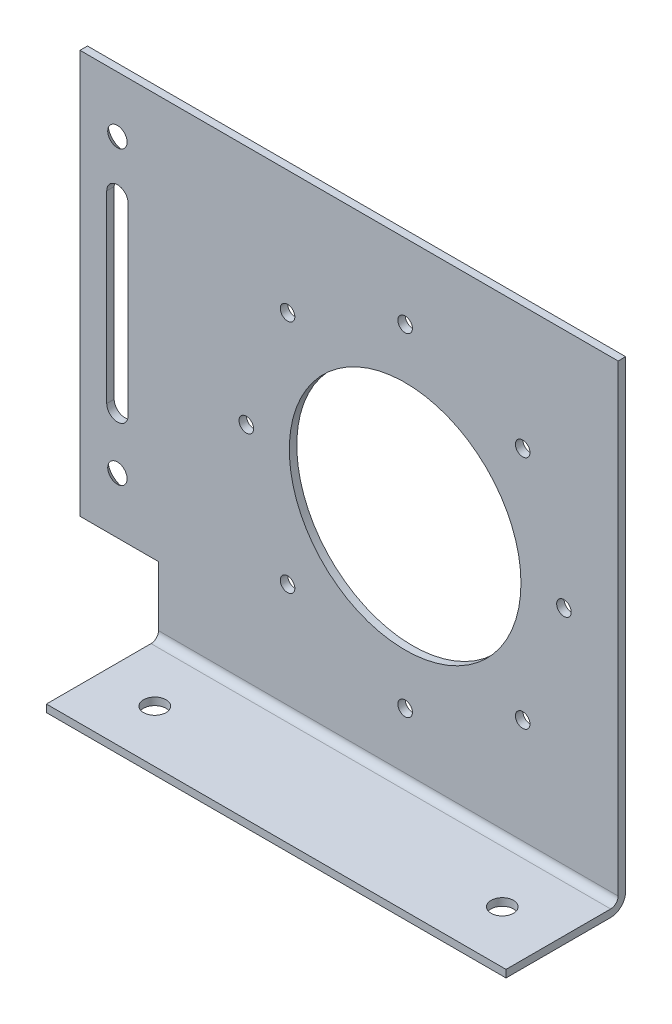
ISO-10303-21;
HEADER;
FILE_DESCRIPTION(('STEP AP214'),'2;1');
FILE_NAME('part.step','',(''),(''),'','','');
FILE_SCHEMA(('AUTOMOTIVE_DESIGN { 1 0 10303 214 1 1 1 1 }'));
ENDSEC;
DATA;
#1=APPLICATION_CONTEXT('core data for automotive mechanical design processes');
#2=APPLICATION_PROTOCOL_DEFINITION('international standard','automotive_design',2000,#1);
#3=PRODUCT_CONTEXT('',#1,'mechanical');
#4=PRODUCT('Part','Part','',(#3));
#5=PRODUCT_RELATED_PRODUCT_CATEGORY('part','',(#4));
#6=PRODUCT_DEFINITION_FORMATION('','',#4);
#7=PRODUCT_DEFINITION_CONTEXT('part definition',#1,'design');
#8=PRODUCT_DEFINITION('design','',#6,#7);
#9=PRODUCT_DEFINITION_SHAPE('','',#8);
#10=(LENGTH_UNIT() NAMED_UNIT(*) SI_UNIT(.MILLI.,.METRE.));
#11=(NAMED_UNIT(*) PLANE_ANGLE_UNIT() SI_UNIT($,.RADIAN.));
#12=(NAMED_UNIT(*) SI_UNIT($,.STERADIAN.) SOLID_ANGLE_UNIT());
#13=UNCERTAINTY_MEASURE_WITH_UNIT(LENGTH_MEASURE(1.E-05),#10,'distance_accuracy_value','');
#14=(GEOMETRIC_REPRESENTATION_CONTEXT(3) GLOBAL_UNCERTAINTY_ASSIGNED_CONTEXT((#13)) GLOBAL_UNIT_ASSIGNED_CONTEXT((#10,
#11,#12)) REPRESENTATION_CONTEXT('',''));
#15=CARTESIAN_POINT('',(0.,0.,0.));
#16=DIRECTION('',(0.,0.,1.));
#17=DIRECTION('',(1.,0.,0.));
#18=AXIS2_PLACEMENT_3D('',#15,#16,#17);
#19=CARTESIAN_POINT('',(0.,0.,4.));
#20=DIRECTION('',(0.,0.,-1.));
#21=DIRECTION('',(1.,0.,0.));
#22=AXIS2_PLACEMENT_3D('',#19,#20,#21);
#23=PLANE('',#22);
#24=CARTESIAN_POINT('',(17.9765527034874,41.3541753746779,4.));
#25=DIRECTION('',(0.,0.,1.));
#26=DIRECTION('',(1.,0.,0.));
#27=AXIS2_PLACEMENT_3D('',#24,#25,#26);
#28=CIRCLE('',#27,1.95);
#29=CARTESIAN_POINT('',(19.9265527034874,41.3541753746779,4.));
#30=VERTEX_POINT('',#29);
#31=EDGE_CURVE('E204',#30,#30,#28,.T.);
#32=ORIENTED_EDGE('',*,*,#31,.F.);
#33=EDGE_LOOP('',(#32));
#34=FACE_BOUND('',#33,.T.);
#35=CARTESIAN_POINT('',(-13.489699059314,28.3204271374793,4.));
#36=DIRECTION('',(0.,0.,1.));
#37=DIRECTION('',(1.,0.,0.));
#38=AXIS2_PLACEMENT_3D('',#35,#36,#37);
#39=CIRCLE('',#38,1.95);
#40=CARTESIAN_POINT('',(-11.539699059314,28.3204271374793,4.));
#41=VERTEX_POINT('',#40);
#42=EDGE_CURVE('E201',#41,#41,#39,.T.);
#43=ORIENTED_EDGE('',*,*,#42,.F.);
#44=EDGE_LOOP('',(#43));
#45=FACE_BOUND('',#44,.T.);
#46=CARTESIAN_POINT('',(60.4765527034874,-3.14582462532208,4.));
#47=DIRECTION('',(0.,0.,1.));
#48=DIRECTION('',(1.,0.,0.));
#49=AXIS2_PLACEMENT_3D('',#46,#47,#48);
#50=CIRCLE('',#49,1.95);
#51=CARTESIAN_POINT('',(62.4265527034874,-3.14582462532208,4.));
#52=VERTEX_POINT('',#51);
#53=EDGE_CURVE('E198',#52,#52,#50,.T.);
#54=ORIENTED_EDGE('',*,*,#53,.F.);
#55=EDGE_LOOP('',(#54));
#56=FACE_BOUND('',#55,.T.);
#57=CARTESIAN_POINT('',(-13.489699059314,-34.6120763881235,4.));
#58=DIRECTION('',(0.,0.,1.));
#59=DIRECTION('',(1.,0.,0.));
#60=AXIS2_PLACEMENT_3D('',#57,#58,#59);
#61=CIRCLE('',#60,1.95);
#62=CARTESIAN_POINT('',(-11.539699059314,-34.6120763881235,4.));
#63=VERTEX_POINT('',#62);
#64=EDGE_CURVE('E195',#63,#63,#61,.T.);
#65=ORIENTED_EDGE('',*,*,#64,.F.);
#66=EDGE_LOOP('',(#65));
#67=FACE_BOUND('',#66,.T.);
#68=CARTESIAN_POINT('',(17.9765527034874,-47.6458246253221,4.));
#69=DIRECTION('',(0.,0.,1.));
#70=DIRECTION('',(1.,0.,0.));
#71=AXIS2_PLACEMENT_3D('',#68,#69,#70);
#72=CIRCLE('',#71,1.95);
#73=CARTESIAN_POINT('',(19.9265527034874,-47.6458246253221,4.));
#74=VERTEX_POINT('',#73);
#75=EDGE_CURVE('E192',#74,#74,#72,.T.);
#76=ORIENTED_EDGE('',*,*,#75,.F.);
#77=EDGE_LOOP('',(#76));
#78=FACE_BOUND('',#77,.T.);
#79=CARTESIAN_POINT('',(49.4428044662887,28.3204271374793,4.));
#80=DIRECTION('',(0.,0.,1.));
#81=DIRECTION('',(1.,0.,0.));
#82=AXIS2_PLACEMENT_3D('',#79,#80,#81);
#83=CIRCLE('',#82,1.95);
#84=CARTESIAN_POINT('',(51.3928044662887,28.3204271374793,4.));
#85=VERTEX_POINT('',#84);
#86=EDGE_CURVE('E189',#85,#85,#83,.T.);
#87=ORIENTED_EDGE('',*,*,#86,.F.);
#88=EDGE_LOOP('',(#87));
#89=FACE_BOUND('',#88,.T.);
#90=CARTESIAN_POINT('',(17.9765527034874,-3.14582462532208,4.));
#91=DIRECTION('',(0.,0.,1.));
#92=DIRECTION('',(1.,0.,0.));
#93=AXIS2_PLACEMENT_3D('',#90,#91,#92);
#94=CIRCLE('',#93,31.);
#95=CARTESIAN_POINT('',(48.9765527034874,-3.14582462532208,4.));
#96=VERTEX_POINT('',#95);
#97=EDGE_CURVE('E186',#96,#96,#94,.T.);
#98=ORIENTED_EDGE('',*,*,#97,.F.);
#99=EDGE_LOOP('',(#98));
#100=FACE_BOUND('',#99,.T.);
#101=CARTESIAN_POINT('',(-24.5234472965126,-3.14582462532208,4.));
#102=DIRECTION('',(0.,0.,1.));
#103=DIRECTION('',(1.,0.,0.));
#104=AXIS2_PLACEMENT_3D('',#101,#102,#103);
#105=CIRCLE('',#104,1.95);
#106=CARTESIAN_POINT('',(-22.5734472965126,-3.14582462532208,4.));
#107=VERTEX_POINT('',#106);
#108=EDGE_CURVE('E183',#107,#107,#105,.T.);
#109=ORIENTED_EDGE('',*,*,#108,.F.);
#110=EDGE_LOOP('',(#109));
#111=FACE_BOUND('',#110,.T.);
#112=CARTESIAN_POINT('',(49.4428044662887,-34.6120763881234,4.));
#113=DIRECTION('',(0.,0.,1.));
#114=DIRECTION('',(1.,0.,0.));
#115=AXIS2_PLACEMENT_3D('',#112,#113,#114);
#116=CIRCLE('',#115,1.95);
#117=CARTESIAN_POINT('',(51.3928044662887,-34.6120763881234,4.));
#118=VERTEX_POINT('',#117);
#119=EDGE_CURVE('E180',#118,#118,#116,.T.);
#120=ORIENTED_EDGE('',*,*,#119,.F.);
#121=EDGE_LOOP('',(#120));
#122=FACE_BOUND('',#121,.T.);
#123=DIRECTION('',(0.,-1.,0.));
#124=VECTOR('',#123,1.);
#125=CARTESIAN_POINT('',(-61.8816570408644,0.,4.));
#126=LINE('',#125,#124);
#127=CARTESIAN_POINT('',(-61.8816570408644,32.3541753746779,4.));
#128=VERTEX_POINT('',#127);
#129=CARTESIAN_POINT('',(-61.8816570408644,-16.9351822342256,4.));
#130=VERTEX_POINT('',#129);
#131=EDGE_CURVE('E150',#128,#130,#126,.T.);
#132=ORIENTED_EDGE('',*,*,#131,.F.);
#133=CARTESIAN_POINT('',(-59.0234472965126,32.3541753746779,4.));
#134=DIRECTION('',(0.,0.,1.));
#135=DIRECTION('',(1.,0.,0.));
#136=AXIS2_PLACEMENT_3D('',#133,#134,#135);
#137=CIRCLE('',#136,2.85820974435178);
#138=CARTESIAN_POINT('',(-56.1652375521608,32.3541753746779,4.));
#139=VERTEX_POINT('',#138);
#140=EDGE_CURVE('E174',#139,#128,#137,.T.);
#141=ORIENTED_EDGE('',*,*,#140,.F.);
#142=DIRECTION('',(0.,1.,0.));
#143=VECTOR('',#142,1.);
#144=CARTESIAN_POINT('',(-56.1652375521608,0.,4.));
#145=LINE('',#144,#143);
#146=CARTESIAN_POINT('',(-56.1652375521608,-16.9351822342256,4.));
#147=VERTEX_POINT('',#146);
#148=EDGE_CURVE('E172',#147,#139,#145,.T.);
#149=ORIENTED_EDGE('',*,*,#148,.F.);
#150=CARTESIAN_POINT('',(-59.0234472965126,-16.9351822342256,4.));
#151=DIRECTION('',(0.,0.,1.));
#152=DIRECTION('',(1.,0.,0.));
#153=AXIS2_PLACEMENT_3D('',#150,#151,#152);
#154=CIRCLE('',#153,2.85820974435177);
#155=EDGE_CURVE('E178',#130,#147,#154,.T.);
#156=ORIENTED_EDGE('',*,*,#155,.F.);
#157=EDGE_LOOP('',(#132,#141,#149,#156));
#158=FACE_BOUND('',#157,.T.);
#159=CARTESIAN_POINT('',(-59.0234472965126,46.3541753746779,4.));
#160=DIRECTION('',(0.,0.,1.));
#161=DIRECTION('',(1.,0.,0.));
#162=AXIS2_PLACEMENT_3D('',#159,#160,#161);
#163=CIRCLE('',#162,2.59);
#164=CARTESIAN_POINT('',(-56.4334472965126,46.3541753746779,4.));
#165=VERTEX_POINT('',#164);
#166=EDGE_CURVE('E43',#165,#165,#163,.T.);
#167=ORIENTED_EDGE('',*,*,#166,.F.);
#168=EDGE_LOOP('',(#167));
#169=FACE_BOUND('',#168,.T.);
#170=CARTESIAN_POINT('',(-59.0234472965126,-31.6458246253221,4.));
#171=DIRECTION('',(0.,0.,1.));
#172=DIRECTION('',(1.,0.,0.));
#173=AXIS2_PLACEMENT_3D('',#170,#171,#172);
#174=CIRCLE('',#173,2.59);
#175=CARTESIAN_POINT('',(-56.4334472965126,-31.6458246253221,4.));
#176=VERTEX_POINT('',#175);
#177=EDGE_CURVE('E213',#176,#176,#174,.T.);
#178=ORIENTED_EDGE('',*,*,#177,.F.);
#179=EDGE_LOOP('',(#178));
#180=FACE_BOUND('',#179,.T.);
#181=DIRECTION('',(0.,1.,0.));
#182=VECTOR('',#181,1.);
#183=CARTESIAN_POINT('',(74.9765527034874,-66.6458246253221,4.));
#184=LINE('',#183,#182);
#185=CARTESIAN_POINT('',(74.9765527034874,-62.6458246253221,4.));
#186=VERTEX_POINT('',#185);
#187=CARTESIAN_POINT('',(74.9765527034874,61.3541753746779,4.));
#188=VERTEX_POINT('',#187);
#189=EDGE_CURVE('E264',#186,#188,#184,.T.);
#190=ORIENTED_EDGE('',*,*,#189,.T.);
#191=DIRECTION('',(-1.,0.,0.));
#192=VECTOR('',#191,1.);
#193=CARTESIAN_POINT('',(74.9765527034874,61.3541753746779,4.));
#194=LINE('',#193,#192);
#195=CARTESIAN_POINT('',(-69.0234472965126,61.3541753746779,4.));
#196=VERTEX_POINT('',#195);
#197=EDGE_CURVE('E244',#188,#196,#194,.T.);
#198=ORIENTED_EDGE('',*,*,#197,.T.);
#199=DIRECTION('',(0.,-1.,0.));
#200=VECTOR('',#199,1.);
#201=CARTESIAN_POINT('',(-69.0234472965126,-46.6458246253221,4.));
#202=LINE('',#201,#200);
#203=CARTESIAN_POINT('',(-69.0234472965126,-46.6458246253221,4.));
#204=VERTEX_POINT('',#203);
#205=EDGE_CURVE('E239',#196,#204,#202,.T.);
#206=ORIENTED_EDGE('',*,*,#205,.T.);
#207=DIRECTION('',(1.,0.,0.));
#208=VECTOR('',#207,1.);
#209=CARTESIAN_POINT('',(-69.0234472965126,-46.6458246253221,4.));
#210=LINE('',#209,#208);
#211=CARTESIAN_POINT('',(-48.0234472965126,-46.6458246253221,4.));
#212=VERTEX_POINT('',#211);
#213=EDGE_CURVE('E258',#204,#212,#210,.T.);
#214=ORIENTED_EDGE('',*,*,#213,.T.);
#215=DIRECTION('',(0.,-1.,0.));
#216=VECTOR('',#215,1.);
#217=CARTESIAN_POINT('',(-48.0234472965126,-46.6458246253221,4.));
#218=LINE('',#217,#216);
#219=CARTESIAN_POINT('',(-48.0234472965126,-62.6458246253221,4.));
#220=VERTEX_POINT('',#219);
#221=EDGE_CURVE('E261',#212,#220,#218,.T.);
#222=ORIENTED_EDGE('',*,*,#221,.T.);
#223=DIRECTION('',(1.,0.,0.));
#224=VECTOR('',#223,1.);
#225=CARTESIAN_POINT('',(-48.0234472965126,-62.6458246253221,4.));
#226=LINE('',#225,#224);
#227=EDGE_CURVE('E284',#186,#220,#226,.F.);
#228=ORIENTED_EDGE('',*,*,#227,.F.);
#229=EDGE_LOOP('',(#190,#198,#206,#214,#222,#228));
#230=FACE_BOUND('',#229,.T.);
#231=ADVANCED_FACE('F39',(#34,#45,#56,#67,#78,#89,#100,#111,#122,#158,#169,#180,#230),#23,.F.);
#232=CARTESIAN_POINT('',(-69.0234472965126,-46.6458246253221,2.));
#233=DIRECTION('',(1.,0.,0.));
#234=DIRECTION('',(0.,0.,1.));
#235=AXIS2_PLACEMENT_3D('',#232,#233,#234);
#236=PLANE('',#235);
#237=ORIENTED_EDGE('',*,*,#205,.F.);
#238=DIRECTION('',(0.,0.,1.));
#239=VECTOR('',#238,1.);
#240=CARTESIAN_POINT('',(-69.0234472965126,61.3541753746779,2.));
#241=LINE('',#240,#239);
#242=CARTESIAN_POINT('',(-69.0234472965126,61.3541753746779,2.));
#243=VERTEX_POINT('',#242);
#244=EDGE_CURVE('E255',#243,#196,#241,.T.);
#245=ORIENTED_EDGE('',*,*,#244,.F.);
#246=DIRECTION('',(0.,-1.,0.));
#247=VECTOR('',#246,1.);
#248=CARTESIAN_POINT('',(-69.0234472965126,-46.6458246253221,2.));
#249=LINE('',#248,#247);
#250=CARTESIAN_POINT('',(-69.0234472965126,-46.6458246253221,2.));
#251=VERTEX_POINT('',#250);
#252=EDGE_CURVE('E240',#243,#251,#249,.T.);
#253=ORIENTED_EDGE('',*,*,#252,.T.);
#254=DIRECTION('',(0.,0.,1.));
#255=VECTOR('',#254,1.);
#256=CARTESIAN_POINT('',(-69.0234472965126,-46.6458246253221,2.));
#257=LINE('',#256,#255);
#258=EDGE_CURVE('E280',#251,#204,#257,.T.);
#259=ORIENTED_EDGE('',*,*,#258,.T.);
#260=EDGE_LOOP('',(#237,#245,#253,#259));
#261=FACE_BOUND('',#260,.T.);
#262=ADVANCED_FACE('F350',(#261),#236,.F.);
#263=CARTESIAN_POINT('',(-69.0234472965126,-46.6458246253221,2.));
#264=DIRECTION('',(0.,1.,0.));
#265=DIRECTION('',(0.,0.,-1.));
#266=AXIS2_PLACEMENT_3D('',#263,#264,#265);
#267=PLANE('',#266);
#268=ORIENTED_EDGE('',*,*,#213,.F.);
#269=ORIENTED_EDGE('',*,*,#258,.F.);
#270=DIRECTION('',(1.,0.,0.));
#271=VECTOR('',#270,1.);
#272=CARTESIAN_POINT('',(-69.0234472965126,-46.6458246253221,2.));
#273=LINE('',#272,#271);
#274=CARTESIAN_POINT('',(-48.0234472965126,-46.6458246253221,2.));
#275=VERTEX_POINT('',#274);
#276=EDGE_CURVE('E243',#251,#275,#273,.T.);
#277=ORIENTED_EDGE('',*,*,#276,.T.);
#278=DIRECTION('',(0.,0.,1.));
#279=VECTOR('',#278,1.);
#280=CARTESIAN_POINT('',(-48.0234472965126,-46.6458246253221,2.));
#281=LINE('',#280,#279);
#282=EDGE_CURVE('E278',#275,#212,#281,.T.);
#283=ORIENTED_EDGE('',*,*,#282,.T.);
#284=EDGE_LOOP('',(#268,#269,#277,#283));
#285=FACE_BOUND('',#284,.T.);
#286=ADVANCED_FACE('F334',(#285),#267,.F.);
#287=CARTESIAN_POINT('',(-48.0234472965126,-46.6458246253221,2.));
#288=DIRECTION('',(1.,0.,0.));
#289=DIRECTION('',(0.,1.,0.));
#290=AXIS2_PLACEMENT_3D('',#287,#288,#289);
#291=PLANE('',#290);
#292=DIRECTION('',(0.,0.,1.));
#293=VECTOR('',#292,1.);
#294=CARTESIAN_POINT('',(-48.0234472965126,-66.6458246253221,2.));
#295=LINE('',#294,#293);
#296=CARTESIAN_POINT('',(-48.0234472965126,-66.6458246253221,6.));
#297=VERTEX_POINT('',#296);
#298=CARTESIAN_POINT('',(-48.0234472965126,-66.6458246253221,34.));
#299=VERTEX_POINT('',#298);
#300=EDGE_CURVE('E275',#297,#299,#295,.T.);
#301=ORIENTED_EDGE('',*,*,#300,.T.);
#302=DIRECTION('',(0.,1.,0.));
#303=VECTOR('',#302,1.);
#304=CARTESIAN_POINT('',(-48.0234472965126,-64.6458246253221,34.));
#305=LINE('',#304,#303);
#306=CARTESIAN_POINT('',(-48.0234472965126,-64.6458246253221,34.));
#307=VERTEX_POINT('',#306);
#308=EDGE_CURVE('E228',#299,#307,#305,.T.);
#309=ORIENTED_EDGE('',*,*,#308,.T.);
#310=DIRECTION('',(0.,0.,-1.));
#311=VECTOR('',#310,1.);
#312=CARTESIAN_POINT('',(-48.0234472965126,-64.6458246253221,34.));
#313=LINE('',#312,#311);
#314=CARTESIAN_POINT('',(-48.0234472965126,-64.6458246253221,6.));
#315=VERTEX_POINT('',#314);
#316=EDGE_CURVE('E236',#307,#315,#313,.T.);
#317=ORIENTED_EDGE('',*,*,#316,.T.);
#318=CARTESIAN_POINT('',(-48.0234472965126,-62.6458246253221,6.));
#319=DIRECTION('',(-1.,0.,0.));
#320=DIRECTION('',(0.,1.,0.));
#321=AXIS2_PLACEMENT_3D('',#318,#319,#320);
#322=CIRCLE('',#321,2.);
#323=EDGE_CURVE('E289',#220,#315,#322,.T.);
#324=ORIENTED_EDGE('',*,*,#323,.F.);
#325=ORIENTED_EDGE('',*,*,#221,.F.);
#326=ORIENTED_EDGE('',*,*,#282,.F.);
#327=DIRECTION('',(0.,-1.,0.));
#328=VECTOR('',#327,1.);
#329=CARTESIAN_POINT('',(-48.0234472965126,-46.6458246253221,2.));
#330=LINE('',#329,#328);
#331=CARTESIAN_POINT('',(-48.0234472965126,-62.6458246253221,2.));
#332=VERTEX_POINT('',#331);
#333=EDGE_CURVE('E247',#275,#332,#330,.T.);
#334=ORIENTED_EDGE('',*,*,#333,.T.);
#335=CARTESIAN_POINT('',(-48.0234472965126,-62.6458246253221,6.));
#336=DIRECTION('',(-1.,0.,0.));
#337=DIRECTION('',(0.,1.,0.));
#338=AXIS2_PLACEMENT_3D('',#335,#336,#337);
#339=CIRCLE('',#338,4.);
#340=EDGE_CURVE('E11',#297,#332,#339,.F.);
#341=ORIENTED_EDGE('',*,*,#340,.F.);
#342=EDGE_LOOP('',(#301,#309,#317,#324,#325,#326,#334,#341));
#343=FACE_BOUND('',#342,.T.);
#344=ADVANCED_FACE('F314',(#343),#291,.F.);
#345=CARTESIAN_POINT('',(74.9765527034874,-66.6458246253221,2.));
#346=DIRECTION('',(0.,1.,0.));
#347=DIRECTION('',(-1.,0.,0.));
#348=AXIS2_PLACEMENT_3D('',#345,#346,#347);
#349=PLANE('',#348);
#350=CARTESIAN_POINT('',(-33.0234472965126,-66.6458246253221,20.));
#351=DIRECTION('',(0.,1.,0.));
#352=DIRECTION('',(1.,0.,0.));
#353=AXIS2_PLACEMENT_3D('',#350,#351,#352);
#354=CIRCLE('',#353,3.);
#355=CARTESIAN_POINT('',(-30.0234472965126,-66.6458246253221,20.));
#356=VERTEX_POINT('',#355);
#357=EDGE_CURVE('E217',#356,#356,#354,.T.);
#358=ORIENTED_EDGE('',*,*,#357,.T.);
#359=EDGE_LOOP('',(#358));
#360=FACE_BOUND('',#359,.T.);
#361=CARTESIAN_POINT('',(59.9765527034874,-66.6458246253221,20.));
#362=DIRECTION('',(0.,1.,0.));
#363=DIRECTION('',(1.,0.,0.));
#364=AXIS2_PLACEMENT_3D('',#361,#362,#363);
#365=CIRCLE('',#364,3.00000000000001);
#366=CARTESIAN_POINT('',(62.9765527034874,-66.6458246253221,20.));
#367=VERTEX_POINT('',#366);
#368=EDGE_CURVE('E216',#367,#367,#365,.T.);
#369=ORIENTED_EDGE('',*,*,#368,.T.);
#370=EDGE_LOOP('',(#369));
#371=FACE_BOUND('',#370,.T.);
#372=DIRECTION('',(0.,0.,1.));
#373=VECTOR('',#372,1.);
#374=CARTESIAN_POINT('',(74.9765527034874,-66.6458246253221,2.));
#375=LINE('',#374,#373);
#376=CARTESIAN_POINT('',(74.9765527034874,-66.6458246253221,6.));
#377=VERTEX_POINT('',#376);
#378=CARTESIAN_POINT('',(74.9765527034874,-66.6458246253221,34.));
#379=VERTEX_POINT('',#378);
#380=EDGE_CURVE('E272',#377,#379,#375,.T.);
#381=ORIENTED_EDGE('',*,*,#380,.T.);
#382=DIRECTION('',(-1.,0.,0.));
#383=VECTOR('',#382,1.);
#384=CARTESIAN_POINT('',(74.9765527034874,-66.6458246253221,34.));
#385=LINE('',#384,#383);
#386=EDGE_CURVE('E225',#379,#299,#385,.T.);
#387=ORIENTED_EDGE('',*,*,#386,.T.);
#388=ORIENTED_EDGE('',*,*,#300,.F.);
#389=DIRECTION('',(1.,0.,0.));
#390=VECTOR('',#389,1.);
#391=CARTESIAN_POINT('',(-48.0234472965126,-66.6458246253221,6.));
#392=LINE('',#391,#390);
#393=EDGE_CURVE('E48',#377,#297,#392,.F.);
#394=ORIENTED_EDGE('',*,*,#393,.F.);
#395=EDGE_LOOP('',(#381,#387,#388,#394));
#396=FACE_BOUND('',#395,.T.);
#397=ADVANCED_FACE('F343',(#360,#371,#396),#349,.F.);
#398=CARTESIAN_POINT('',(74.9765527034874,-66.6458246253221,2.));
#399=DIRECTION('',(-1.,0.,0.));
#400=DIRECTION('',(0.,0.,-1.));
#401=AXIS2_PLACEMENT_3D('',#398,#399,#400);
#402=PLANE('',#401);
#403=DIRECTION('',(0.,1.,0.));
#404=VECTOR('',#403,1.);
#405=CARTESIAN_POINT('',(74.9765527034874,-66.6458246253221,2.));
#406=LINE('',#405,#404);
#407=CARTESIAN_POINT('',(74.9765527034874,-62.6458246253221,2.));
#408=VERTEX_POINT('',#407);
#409=CARTESIAN_POINT('',(74.9765527034874,61.3541753746779,2.));
#410=VERTEX_POINT('',#409);
#411=EDGE_CURVE('E250',#408,#410,#406,.T.);
#412=ORIENTED_EDGE('',*,*,#411,.T.);
#413=DIRECTION('',(0.,0.,1.));
#414=VECTOR('',#413,1.);
#415=CARTESIAN_POINT('',(74.9765527034874,61.3541753746779,2.));
#416=LINE('',#415,#414);
#417=EDGE_CURVE('E270',#410,#188,#416,.T.);
#418=ORIENTED_EDGE('',*,*,#417,.T.);
#419=ORIENTED_EDGE('',*,*,#189,.F.);
#420=CARTESIAN_POINT('',(74.9765527034874,-62.6458246253221,6.));
#421=DIRECTION('',(1.,0.,0.));
#422=DIRECTION('',(0.,0.,-1.));
#423=AXIS2_PLACEMENT_3D('',#420,#421,#422);
#424=CIRCLE('',#423,2.);
#425=CARTESIAN_POINT('',(74.9765527034874,-64.6458246253221,6.));
#426=VERTEX_POINT('',#425);
#427=EDGE_CURVE('E287',#426,#186,#424,.T.);
#428=ORIENTED_EDGE('',*,*,#427,.F.);
#429=DIRECTION('',(0.,0.,-1.));
#430=VECTOR('',#429,1.);
#431=CARTESIAN_POINT('',(74.9765527034874,-64.6458246253221,34.));
#432=LINE('',#431,#430);
#433=CARTESIAN_POINT('',(74.9765527034874,-64.6458246253221,34.));
#434=VERTEX_POINT('',#433);
#435=EDGE_CURVE('E233',#434,#426,#432,.T.);
#436=ORIENTED_EDGE('',*,*,#435,.F.);
#437=DIRECTION('',(0.,-1.,0.));
#438=VECTOR('',#437,1.);
#439=CARTESIAN_POINT('',(74.9765527034874,-66.6458246253221,34.));
#440=LINE('',#439,#438);
#441=EDGE_CURVE('E223',#434,#379,#440,.T.);
#442=ORIENTED_EDGE('',*,*,#441,.T.);
#443=ORIENTED_EDGE('',*,*,#380,.F.);
#444=CARTESIAN_POINT('',(74.9765527034874,-62.6458246253221,6.));
#445=DIRECTION('',(1.,0.,0.));
#446=DIRECTION('',(0.,0.,-1.));
#447=AXIS2_PLACEMENT_3D('',#444,#445,#446);
#448=CIRCLE('',#447,4.);
#449=EDGE_CURVE('E294',#408,#377,#448,.F.);
#450=ORIENTED_EDGE('',*,*,#449,.F.);
#451=EDGE_LOOP('',(#412,#418,#419,#428,#436,#442,#443,#450));
#452=FACE_BOUND('',#451,.T.);
#453=ADVANCED_FACE('F323',(#452),#402,.F.);
#454=CARTESIAN_POINT('',(74.9765527034874,61.3541753746779,2.));
#455=DIRECTION('',(0.,-1.,0.));
#456=DIRECTION('',(1.,0.,0.));
#457=AXIS2_PLACEMENT_3D('',#454,#455,#456);
#458=PLANE('',#457);
#459=ORIENTED_EDGE('',*,*,#197,.F.);
#460=ORIENTED_EDGE('',*,*,#417,.F.);
#461=DIRECTION('',(-1.,0.,0.));
#462=VECTOR('',#461,1.);
#463=CARTESIAN_POINT('',(74.9765527034874,61.3541753746779,2.));
#464=LINE('',#463,#462);
#465=EDGE_CURVE('E253',#410,#243,#464,.T.);
#466=ORIENTED_EDGE('',*,*,#465,.T.);
#467=ORIENTED_EDGE('',*,*,#244,.T.);
#468=EDGE_LOOP('',(#459,#460,#466,#467));
#469=FACE_BOUND('',#468,.T.);
#470=ADVANCED_FACE('F347',(#469),#458,.F.);
#471=CARTESIAN_POINT('',(0.,0.,2.));
#472=DIRECTION('',(0.,0.,-1.));
#473=DIRECTION('',(1.,0.,0.));
#474=AXIS2_PLACEMENT_3D('',#471,#472,#473);
#475=PLANE('',#474);
#476=CARTESIAN_POINT('',(17.9765527034874,41.3541753746779,2.));
#477=DIRECTION('',(0.,0.,1.));
#478=DIRECTION('',(1.,0.,0.));
#479=AXIS2_PLACEMENT_3D('',#476,#477,#478);
#480=CIRCLE('',#479,1.95);
#481=CARTESIAN_POINT('',(19.9265527034874,41.3541753746779,2.));
#482=VERTEX_POINT('',#481);
#483=EDGE_CURVE('E175',#482,#482,#480,.T.);
#484=ORIENTED_EDGE('',*,*,#483,.T.);
#485=EDGE_LOOP('',(#484));
#486=FACE_BOUND('',#485,.T.);
#487=CARTESIAN_POINT('',(-13.489699059314,28.3204271374793,2.));
#488=DIRECTION('',(0.,0.,1.));
#489=DIRECTION('',(1.,0.,0.));
#490=AXIS2_PLACEMENT_3D('',#487,#488,#489);
#491=CIRCLE('',#490,1.95);
#492=CARTESIAN_POINT('',(-11.539699059314,28.3204271374793,2.));
#493=VERTEX_POINT('',#492);
#494=EDGE_CURVE('E163',#493,#493,#491,.T.);
#495=ORIENTED_EDGE('',*,*,#494,.T.);
#496=EDGE_LOOP('',(#495));
#497=FACE_BOUND('',#496,.T.);
#498=CARTESIAN_POINT('',(60.4765527034874,-3.14582462532208,2.));
#499=DIRECTION('',(0.,0.,1.));
#500=DIRECTION('',(1.,0.,0.));
#501=AXIS2_PLACEMENT_3D('',#498,#499,#500);
#502=CIRCLE('',#501,1.95);
#503=CARTESIAN_POINT('',(62.4265527034874,-3.14582462532208,2.));
#504=VERTEX_POINT('',#503);
#505=EDGE_CURVE('E167',#504,#504,#502,.T.);
#506=ORIENTED_EDGE('',*,*,#505,.T.);
#507=EDGE_LOOP('',(#506));
#508=FACE_BOUND('',#507,.T.);
#509=CARTESIAN_POINT('',(-13.489699059314,-34.6120763881235,2.));
#510=DIRECTION('',(0.,0.,1.));
#511=DIRECTION('',(1.,0.,0.));
#512=AXIS2_PLACEMENT_3D('',#509,#510,#511);
#513=CIRCLE('',#512,1.95);
#514=CARTESIAN_POINT('',(-11.539699059314,-34.6120763881235,2.));
#515=VERTEX_POINT('',#514);
#516=EDGE_CURVE('E642',#515,#515,#513,.T.);
#517=ORIENTED_EDGE('',*,*,#516,.T.);
#518=EDGE_LOOP('',(#517));
#519=FACE_BOUND('',#518,.T.);
#520=CARTESIAN_POINT('',(17.9765527034874,-47.6458246253221,2.));
#521=DIRECTION('',(0.,0.,1.));
#522=DIRECTION('',(1.,0.,0.));
#523=AXIS2_PLACEMENT_3D('',#520,#521,#522);
#524=CIRCLE('',#523,1.95);
#525=CARTESIAN_POINT('',(19.9265527034874,-47.6458246253221,2.));
#526=VERTEX_POINT('',#525);
#527=EDGE_CURVE('E637',#526,#526,#524,.T.);
#528=ORIENTED_EDGE('',*,*,#527,.T.);
#529=EDGE_LOOP('',(#528));
#530=FACE_BOUND('',#529,.T.);
#531=CARTESIAN_POINT('',(49.4428044662887,28.3204271374793,2.));
#532=DIRECTION('',(0.,0.,1.));
#533=DIRECTION('',(1.,0.,0.));
#534=AXIS2_PLACEMENT_3D('',#531,#532,#533);
#535=CIRCLE('',#534,1.95);
#536=CARTESIAN_POINT('',(51.3928044662887,28.3204271374793,2.));
#537=VERTEX_POINT('',#536);
#538=EDGE_CURVE('E630',#537,#537,#535,.T.);
#539=ORIENTED_EDGE('',*,*,#538,.T.);
#540=EDGE_LOOP('',(#539));
#541=FACE_BOUND('',#540,.T.);
#542=CARTESIAN_POINT('',(17.9765527034874,-3.14582462532208,2.));
#543=DIRECTION('',(0.,0.,1.));
#544=DIRECTION('',(1.,0.,0.));
#545=AXIS2_PLACEMENT_3D('',#542,#543,#544);
#546=CIRCLE('',#545,31.);
#547=CARTESIAN_POINT('',(48.9765527034874,-3.14582462532208,2.));
#548=VERTEX_POINT('',#547);
#549=EDGE_CURVE('E626',#548,#548,#546,.T.);
#550=ORIENTED_EDGE('',*,*,#549,.T.);
#551=EDGE_LOOP('',(#550));
#552=FACE_BOUND('',#551,.T.);
#553=CARTESIAN_POINT('',(-24.5234472965126,-3.14582462532208,2.));
#554=DIRECTION('',(0.,0.,1.));
#555=DIRECTION('',(1.,0.,0.));
#556=AXIS2_PLACEMENT_3D('',#553,#554,#555);
#557=CIRCLE('',#556,1.95);
#558=CARTESIAN_POINT('',(-22.5734472965126,-3.14582462532208,2.));
#559=VERTEX_POINT('',#558);
#560=EDGE_CURVE('E633',#559,#559,#557,.T.);
#561=ORIENTED_EDGE('',*,*,#560,.T.);
#562=EDGE_LOOP('',(#561));
#563=FACE_BOUND('',#562,.T.);
#564=CARTESIAN_POINT('',(49.4428044662887,-34.6120763881234,2.));
#565=DIRECTION('',(0.,0.,1.));
#566=DIRECTION('',(1.,0.,0.));
#567=AXIS2_PLACEMENT_3D('',#564,#565,#566);
#568=CIRCLE('',#567,1.95);
#569=CARTESIAN_POINT('',(51.3928044662887,-34.6120763881234,2.));
#570=VERTEX_POINT('',#569);
#571=EDGE_CURVE('E634',#570,#570,#568,.T.);
#572=ORIENTED_EDGE('',*,*,#571,.T.);
#573=EDGE_LOOP('',(#572));
#574=FACE_BOUND('',#573,.T.);
#575=CARTESIAN_POINT('',(-59.0234472965126,-16.9351822342256,2.));
#576=DIRECTION('',(0.,0.,1.));
#577=DIRECTION('',(1.,0.,0.));
#578=AXIS2_PLACEMENT_3D('',#575,#576,#577);
#579=CIRCLE('',#578,2.85820974435177);
#580=CARTESIAN_POINT('',(-61.8816570408644,-16.9351822342256,2.));
#581=VERTEX_POINT('',#580);
#582=CARTESIAN_POINT('',(-56.1652375521608,-16.9351822342256,2.));
#583=VERTEX_POINT('',#582);
#584=EDGE_CURVE('E159',#581,#583,#579,.T.);
#585=ORIENTED_EDGE('',*,*,#584,.T.);
#586=DIRECTION('',(0.,1.,0.));
#587=VECTOR('',#586,1.);
#588=CARTESIAN_POINT('',(-56.1652375521608,-16.9351822342256,2.));
#589=LINE('',#588,#587);
#590=CARTESIAN_POINT('',(-56.1652375521608,32.3541753746779,2.));
#591=VERTEX_POINT('',#590);
#592=EDGE_CURVE('E164',#583,#591,#589,.T.);
#593=ORIENTED_EDGE('',*,*,#592,.T.);
#594=CARTESIAN_POINT('',(-59.0234472965126,32.3541753746779,2.));
#595=DIRECTION('',(0.,0.,1.));
#596=DIRECTION('',(1.,0.,0.));
#597=AXIS2_PLACEMENT_3D('',#594,#595,#596);
#598=CIRCLE('',#597,2.85820974435178);
#599=CARTESIAN_POINT('',(-61.8816570408644,32.3541753746779,2.));
#600=VERTEX_POINT('',#599);
#601=EDGE_CURVE('E160',#591,#600,#598,.T.);
#602=ORIENTED_EDGE('',*,*,#601,.T.);
#603=DIRECTION('',(0.,-1.,0.));
#604=VECTOR('',#603,1.);
#605=CARTESIAN_POINT('',(-61.8816570408644,-16.9351822342256,2.));
#606=LINE('',#605,#604);
#607=EDGE_CURVE('E147',#600,#581,#606,.T.);
#608=ORIENTED_EDGE('',*,*,#607,.T.);
#609=EDGE_LOOP('',(#585,#593,#602,#608));
#610=FACE_BOUND('',#609,.T.);
#611=CARTESIAN_POINT('',(-59.0234472965126,46.3541753746779,2.));
#612=DIRECTION('',(0.,0.,1.));
#613=DIRECTION('',(1.,0.,0.));
#614=AXIS2_PLACEMENT_3D('',#611,#612,#613);
#615=CIRCLE('',#614,4.59);
#616=CARTESIAN_POINT('',(-54.4334472965126,46.3541753746779,2.));
#617=VERTEX_POINT('',#616);
#618=EDGE_CURVE('E207',#617,#617,#615,.T.);
#619=ORIENTED_EDGE('',*,*,#618,.T.);
#620=EDGE_LOOP('',(#619));
#621=FACE_BOUND('',#620,.T.);
#622=CARTESIAN_POINT('',(-59.0234472965126,-31.6458246253221,2.));
#623=DIRECTION('',(0.,0.,1.));
#624=DIRECTION('',(1.,0.,0.));
#625=AXIS2_PLACEMENT_3D('',#622,#623,#624);
#626=CIRCLE('',#625,4.59);
#627=CARTESIAN_POINT('',(-54.4334472965126,-31.6458246253221,2.));
#628=VERTEX_POINT('',#627);
#629=EDGE_CURVE('E210',#628,#628,#626,.T.);
#630=ORIENTED_EDGE('',*,*,#629,.T.);
#631=EDGE_LOOP('',(#630));
#632=FACE_BOUND('',#631,.T.);
#633=ORIENTED_EDGE('',*,*,#333,.F.);
#634=ORIENTED_EDGE('',*,*,#276,.F.);
#635=ORIENTED_EDGE('',*,*,#252,.F.);
#636=ORIENTED_EDGE('',*,*,#465,.F.);
#637=ORIENTED_EDGE('',*,*,#411,.F.);
#638=DIRECTION('',(1.,0.,0.));
#639=VECTOR('',#638,1.);
#640=CARTESIAN_POINT('',(74.9765527034874,-62.6458246253221,2.));
#641=LINE('',#640,#639);
#642=EDGE_CURVE('E292',#332,#408,#641,.T.);
#643=ORIENTED_EDGE('',*,*,#642,.F.);
#644=EDGE_LOOP('',(#633,#634,#635,#636,#637,#643));
#645=FACE_BOUND('',#644,.T.);
#646=ADVANCED_FACE('F156',(#486,#497,#508,#519,#530,#541,#552,#563,#574,#610,#621,#632,#645),
#475,.T.);
#647=CARTESIAN_POINT('',(74.9765527034874,-64.6458246253221,34.));
#648=DIRECTION('',(0.,-1.,0.));
#649=DIRECTION('',(0.,0.,1.));
#650=AXIS2_PLACEMENT_3D('',#647,#648,#649);
#651=PLANE('',#650);
#652=CARTESIAN_POINT('',(-33.0234472965126,-64.6458246253221,20.));
#653=DIRECTION('',(0.,1.,0.));
#654=DIRECTION('',(0.,0.,1.));
#655=AXIS2_PLACEMENT_3D('',#652,#653,#654);
#656=CIRCLE('',#655,3.);
#657=CARTESIAN_POINT('',(-33.0234472965126,-64.6458246253221,23.));
#658=VERTEX_POINT('',#657);
#659=EDGE_CURVE('E226',#658,#658,#656,.T.);
#660=ORIENTED_EDGE('',*,*,#659,.F.);
#661=EDGE_LOOP('',(#660));
#662=FACE_BOUND('',#661,.T.);
#663=CARTESIAN_POINT('',(59.9765527034874,-64.6458246253221,20.));
#664=DIRECTION('',(0.,1.,0.));
#665=DIRECTION('',(0.,0.,1.));
#666=AXIS2_PLACEMENT_3D('',#663,#664,#665);
#667=CIRCLE('',#666,3.00000000000001);
#668=CARTESIAN_POINT('',(59.9765527034874,-64.6458246253221,23.));
#669=VERTEX_POINT('',#668);
#670=EDGE_CURVE('E220',#669,#669,#667,.T.);
#671=ORIENTED_EDGE('',*,*,#670,.F.);
#672=EDGE_LOOP('',(#671));
#673=FACE_BOUND('',#672,.T.);
#674=ORIENTED_EDGE('',*,*,#316,.F.);
#675=DIRECTION('',(1.,0.,0.));
#676=VECTOR('',#675,1.);
#677=CARTESIAN_POINT('',(74.9765527034874,-64.6458246253221,34.));
#678=LINE('',#677,#676);
#679=EDGE_CURVE('E231',#307,#434,#678,.T.);
#680=ORIENTED_EDGE('',*,*,#679,.T.);
#681=ORIENTED_EDGE('',*,*,#435,.T.);
#682=DIRECTION('',(1.,0.,0.));
#683=VECTOR('',#682,1.);
#684=CARTESIAN_POINT('',(74.9765527034874,-64.6458246253221,6.));
#685=LINE('',#684,#683);
#686=EDGE_CURVE('E282',#315,#426,#685,.T.);
#687=ORIENTED_EDGE('',*,*,#686,.F.);
#688=EDGE_LOOP('',(#674,#680,#681,#687));
#689=FACE_BOUND('',#688,.T.);
#690=ADVANCED_FACE('F303',(#662,#673,#689),#651,.F.);
#691=CARTESIAN_POINT('',(0.,0.,34.));
#692=DIRECTION('',(0.,0.,-1.));
#693=DIRECTION('',(1.,0.,0.));
#694=AXIS2_PLACEMENT_3D('',#691,#692,#693);
#695=PLANE('',#694);
#696=ORIENTED_EDGE('',*,*,#441,.F.);
#697=ORIENTED_EDGE('',*,*,#679,.F.);
#698=ORIENTED_EDGE('',*,*,#308,.F.);
#699=ORIENTED_EDGE('',*,*,#386,.F.);
#700=EDGE_LOOP('',(#696,#697,#698,#699));
#701=FACE_BOUND('',#700,.T.);
#702=ADVANCED_FACE('F306',(#701),#695,.F.);
#703=CARTESIAN_POINT('',(74.9765527034874,-62.6458246253221,6.));
#704=DIRECTION('',(-1.,0.,0.));
#705=DIRECTION('',(0.,0.,-1.));
#706=AXIS2_PLACEMENT_3D('',#703,#704,#705);
#707=CYLINDRICAL_SURFACE('',#706,2.);
#708=ORIENTED_EDGE('',*,*,#323,.T.);
#709=ORIENTED_EDGE('',*,*,#686,.T.);
#710=ORIENTED_EDGE('',*,*,#427,.T.);
#711=ORIENTED_EDGE('',*,*,#227,.T.);
#712=EDGE_LOOP('',(#708,#709,#710,#711));
#713=FACE_BOUND('',#712,.T.);
#714=ADVANCED_FACE('F327',(#713),#707,.F.);
#715=CARTESIAN_POINT('',(0.,-62.6458246253221,6.));
#716=DIRECTION('',(-1.,0.,0.));
#717=DIRECTION('',(0.,-1.,0.));
#718=AXIS2_PLACEMENT_3D('',#715,#716,#717);
#719=CYLINDRICAL_SURFACE('',#718,4.);
#720=ORIENTED_EDGE('',*,*,#340,.T.);
#721=ORIENTED_EDGE('',*,*,#642,.T.);
#722=ORIENTED_EDGE('',*,*,#449,.T.);
#723=ORIENTED_EDGE('',*,*,#393,.T.);
#724=EDGE_LOOP('',(#720,#721,#722,#723));
#725=FACE_BOUND('',#724,.T.);
#726=ADVANCED_FACE('F41',(#725),#719,.T.);
#727=CARTESIAN_POINT('',(59.9765527034874,61.3541753746779,20.));
#728=DIRECTION('',(0.,-1.,0.));
#729=DIRECTION('',(1.,0.,0.));
#730=AXIS2_PLACEMENT_3D('',#727,#728,#729);
#731=CYLINDRICAL_SURFACE('',#730,3.00000000000001);
#732=ORIENTED_EDGE('',*,*,#368,.F.);
#733=EDGE_LOOP('',(#732));
#734=FACE_BOUND('',#733,.T.);
#735=ORIENTED_EDGE('',*,*,#670,.T.);
#736=EDGE_LOOP('',(#735));
#737=FACE_BOUND('',#736,.T.);
#738=ADVANCED_FACE('F366',(#734,#737),#731,.F.);
#739=CARTESIAN_POINT('',(-33.0234472965126,61.3541753746779,20.));
#740=DIRECTION('',(0.,-1.,0.));
#741=DIRECTION('',(1.,0.,0.));
#742=AXIS2_PLACEMENT_3D('',#739,#740,#741);
#743=CYLINDRICAL_SURFACE('',#742,3.);
#744=ORIENTED_EDGE('',*,*,#357,.F.);
#745=EDGE_LOOP('',(#744));
#746=FACE_BOUND('',#745,.T.);
#747=ORIENTED_EDGE('',*,*,#659,.T.);
#748=EDGE_LOOP('',(#747));
#749=FACE_BOUND('',#748,.T.);
#750=ADVANCED_FACE('F301',(#746,#749),#743,.F.);
#751=CARTESIAN_POINT('',(-59.0234472965126,-31.6458246253221,2.));
#752=DIRECTION('',(0.,0.,-1.));
#753=DIRECTION('',(1.,0.,0.));
#754=AXIS2_PLACEMENT_3D('',#751,#752,#753);
#755=CONICAL_SURFACE('',#754,4.59,0.785398163397449);
#756=ORIENTED_EDGE('',*,*,#629,.F.);
#757=EDGE_LOOP('',(#756));
#758=FACE_BOUND('',#757,.T.);
#759=ORIENTED_EDGE('',*,*,#177,.T.);
#760=EDGE_LOOP('',(#759));
#761=FACE_BOUND('',#760,.T.);
#762=ADVANCED_FACE('F448',(#758,#761),#755,.F.);
#763=CARTESIAN_POINT('',(-59.0234472965126,46.3541753746779,2.));
#764=DIRECTION('',(0.,0.,-1.));
#765=DIRECTION('',(1.,0.,0.));
#766=AXIS2_PLACEMENT_3D('',#763,#764,#765);
#767=CONICAL_SURFACE('',#766,4.59,0.785398163397447);
#768=ORIENTED_EDGE('',*,*,#618,.F.);
#769=EDGE_LOOP('',(#768));
#770=FACE_BOUND('',#769,.T.);
#771=ORIENTED_EDGE('',*,*,#166,.T.);
#772=EDGE_LOOP('',(#771));
#773=FACE_BOUND('',#772,.T.);
#774=ADVANCED_FACE('F456',(#770,#773),#767,.F.);
#775=CARTESIAN_POINT('',(-59.0234472965126,-16.9351822342256,34.));
#776=DIRECTION('',(0.,0.,-1.));
#777=DIRECTION('',(1.,0.,0.));
#778=AXIS2_PLACEMENT_3D('',#775,#776,#777);
#779=CYLINDRICAL_SURFACE('',#778,2.85820974435177);
#780=DIRECTION('',(0.,0.,-1.));
#781=VECTOR('',#780,1.);
#782=CARTESIAN_POINT('',(-61.8816570408644,-16.9351822342256,34.));
#783=LINE('',#782,#781);
#784=EDGE_CURVE('E144',#130,#581,#783,.T.);
#785=ORIENTED_EDGE('',*,*,#784,.F.);
#786=ORIENTED_EDGE('',*,*,#155,.T.);
#787=DIRECTION('',(0.,0.,-1.));
#788=VECTOR('',#787,1.);
#789=CARTESIAN_POINT('',(-56.1652375521608,-16.9351822342256,34.));
#790=LINE('',#789,#788);
#791=EDGE_CURVE('E64',#147,#583,#790,.T.);
#792=ORIENTED_EDGE('',*,*,#791,.T.);
#793=ORIENTED_EDGE('',*,*,#584,.F.);
#794=EDGE_LOOP('',(#785,#786,#792,#793));
#795=FACE_BOUND('',#794,.T.);
#796=ADVANCED_FACE('F162',(#795),#779,.F.);
#797=CARTESIAN_POINT('',(-61.8816570408644,-16.9351822342256,34.));
#798=DIRECTION('',(-1.,0.,0.));
#799=DIRECTION('',(0.,-1.,0.));
#800=AXIS2_PLACEMENT_3D('',#797,#798,#799);
#801=PLANE('',#800);
#802=DIRECTION('',(0.,0.,-1.));
#803=VECTOR('',#802,1.);
#804=CARTESIAN_POINT('',(-61.8816570408644,32.3541753746779,34.));
#805=LINE('',#804,#803);
#806=EDGE_CURVE('E152',#128,#600,#805,.T.);
#807=ORIENTED_EDGE('',*,*,#806,.F.);
#808=ORIENTED_EDGE('',*,*,#131,.T.);
#809=ORIENTED_EDGE('',*,*,#784,.T.);
#810=ORIENTED_EDGE('',*,*,#607,.F.);
#811=EDGE_LOOP('',(#807,#808,#809,#810));
#812=FACE_BOUND('',#811,.T.);
#813=ADVANCED_FACE('F146',(#812),#801,.F.);
#814=CARTESIAN_POINT('',(-59.0234472965126,32.3541753746779,34.));
#815=DIRECTION('',(0.,0.,-1.));
#816=DIRECTION('',(1.,0.,0.));
#817=AXIS2_PLACEMENT_3D('',#814,#815,#816);
#818=CYLINDRICAL_SURFACE('',#817,2.85820974435178);
#819=DIRECTION('',(0.,0.,-1.));
#820=VECTOR('',#819,1.);
#821=CARTESIAN_POINT('',(-56.1652375521608,32.3541753746779,34.));
#822=LINE('',#821,#820);
#823=EDGE_CURVE('E56',#139,#591,#822,.T.);
#824=ORIENTED_EDGE('',*,*,#823,.F.);
#825=ORIENTED_EDGE('',*,*,#140,.T.);
#826=ORIENTED_EDGE('',*,*,#806,.T.);
#827=ORIENTED_EDGE('',*,*,#601,.F.);
#828=EDGE_LOOP('',(#824,#825,#826,#827));
#829=FACE_BOUND('',#828,.T.);
#830=ADVANCED_FACE('F482',(#829),#818,.F.);
#831=CARTESIAN_POINT('',(-56.1652375521608,-16.9351822342256,34.));
#832=DIRECTION('',(1.,0.,0.));
#833=DIRECTION('',(0.,0.,1.));
#834=AXIS2_PLACEMENT_3D('',#831,#832,#833);
#835=PLANE('',#834);
#836=ORIENTED_EDGE('',*,*,#791,.F.);
#837=ORIENTED_EDGE('',*,*,#148,.T.);
#838=ORIENTED_EDGE('',*,*,#823,.T.);
#839=ORIENTED_EDGE('',*,*,#592,.F.);
#840=EDGE_LOOP('',(#836,#837,#838,#839));
#841=FACE_BOUND('',#840,.T.);
#842=ADVANCED_FACE('F491',(#841),#835,.F.);
#843=CARTESIAN_POINT('',(49.4428044662887,-34.6120763881234,34.));
#844=DIRECTION('',(0.,0.,-1.));
#845=DIRECTION('',(1.,0.,0.));
#846=AXIS2_PLACEMENT_3D('',#843,#844,#845);
#847=CYLINDRICAL_SURFACE('',#846,1.95);
#848=ORIENTED_EDGE('',*,*,#571,.F.);
#849=EDGE_LOOP('',(#848));
#850=FACE_BOUND('',#849,.T.);
#851=ORIENTED_EDGE('',*,*,#119,.T.);
#852=EDGE_LOOP('',(#851));
#853=FACE_BOUND('',#852,.T.);
#854=ADVANCED_FACE('F500',(#850,#853),#847,.F.);
#855=CARTESIAN_POINT('',(-24.5234472965126,-3.14582462532208,34.));
#856=DIRECTION('',(0.,0.,-1.));
#857=DIRECTION('',(1.,0.,0.));
#858=AXIS2_PLACEMENT_3D('',#855,#856,#857);
#859=CYLINDRICAL_SURFACE('',#858,1.95);
#860=ORIENTED_EDGE('',*,*,#560,.F.);
#861=EDGE_LOOP('',(#860));
#862=FACE_BOUND('',#861,.T.);
#863=ORIENTED_EDGE('',*,*,#108,.T.);
#864=EDGE_LOOP('',(#863));
#865=FACE_BOUND('',#864,.T.);
#866=ADVANCED_FACE('F511',(#862,#865),#859,.F.);
#867=CARTESIAN_POINT('',(17.9765527034874,-3.14582462532208,34.));
#868=DIRECTION('',(0.,0.,-1.));
#869=DIRECTION('',(1.,0.,0.));
#870=AXIS2_PLACEMENT_3D('',#867,#868,#869);
#871=CYLINDRICAL_SURFACE('',#870,31.);
#872=ORIENTED_EDGE('',*,*,#549,.F.);
#873=EDGE_LOOP('',(#872));
#874=FACE_BOUND('',#873,.T.);
#875=ORIENTED_EDGE('',*,*,#97,.T.);
#876=EDGE_LOOP('',(#875));
#877=FACE_BOUND('',#876,.T.);
#878=ADVANCED_FACE('F522',(#874,#877),#871,.F.);
#879=CARTESIAN_POINT('',(49.4428044662887,28.3204271374793,34.));
#880=DIRECTION('',(0.,0.,-1.));
#881=DIRECTION('',(1.,0.,0.));
#882=AXIS2_PLACEMENT_3D('',#879,#880,#881);
#883=CYLINDRICAL_SURFACE('',#882,1.95);
#884=ORIENTED_EDGE('',*,*,#538,.F.);
#885=EDGE_LOOP('',(#884));
#886=FACE_BOUND('',#885,.T.);
#887=ORIENTED_EDGE('',*,*,#86,.T.);
#888=EDGE_LOOP('',(#887));
#889=FACE_BOUND('',#888,.T.);
#890=ADVANCED_FACE('F532',(#886,#889),#883,.F.);
#891=CARTESIAN_POINT('',(17.9765527034874,-47.6458246253221,34.));
#892=DIRECTION('',(0.,0.,-1.));
#893=DIRECTION('',(1.,0.,0.));
#894=AXIS2_PLACEMENT_3D('',#891,#892,#893);
#895=CYLINDRICAL_SURFACE('',#894,1.95);
#896=ORIENTED_EDGE('',*,*,#527,.F.);
#897=EDGE_LOOP('',(#896));
#898=FACE_BOUND('',#897,.T.);
#899=ORIENTED_EDGE('',*,*,#75,.T.);
#900=EDGE_LOOP('',(#899));
#901=FACE_BOUND('',#900,.T.);
#902=ADVANCED_FACE('F541',(#898,#901),#895,.F.);
#903=CARTESIAN_POINT('',(-13.489699059314,-34.6120763881235,34.));
#904=DIRECTION('',(0.,0.,-1.));
#905=DIRECTION('',(1.,0.,0.));
#906=AXIS2_PLACEMENT_3D('',#903,#904,#905);
#907=CYLINDRICAL_SURFACE('',#906,1.95);
#908=ORIENTED_EDGE('',*,*,#516,.F.);
#909=EDGE_LOOP('',(#908));
#910=FACE_BOUND('',#909,.T.);
#911=ORIENTED_EDGE('',*,*,#64,.T.);
#912=EDGE_LOOP('',(#911));
#913=FACE_BOUND('',#912,.T.);
#914=ADVANCED_FACE('F551',(#910,#913),#907,.F.);
#915=CARTESIAN_POINT('',(60.4765527034874,-3.14582462532208,34.));
#916=DIRECTION('',(0.,0.,-1.));
#917=DIRECTION('',(1.,0.,0.));
#918=AXIS2_PLACEMENT_3D('',#915,#916,#917);
#919=CYLINDRICAL_SURFACE('',#918,1.95);
#920=ORIENTED_EDGE('',*,*,#505,.F.);
#921=EDGE_LOOP('',(#920));
#922=FACE_BOUND('',#921,.T.);
#923=ORIENTED_EDGE('',*,*,#53,.T.);
#924=EDGE_LOOP('',(#923));
#925=FACE_BOUND('',#924,.T.);
#926=ADVANCED_FACE('F562',(#922,#925),#919,.F.);
#927=CARTESIAN_POINT('',(-13.489699059314,28.3204271374793,34.));
#928=DIRECTION('',(0.,0.,-1.));
#929=DIRECTION('',(1.,0.,0.));
#930=AXIS2_PLACEMENT_3D('',#927,#928,#929);
#931=CYLINDRICAL_SURFACE('',#930,1.95);
#932=ORIENTED_EDGE('',*,*,#494,.F.);
#933=EDGE_LOOP('',(#932));
#934=FACE_BOUND('',#933,.T.);
#935=ORIENTED_EDGE('',*,*,#42,.T.);
#936=EDGE_LOOP('',(#935));
#937=FACE_BOUND('',#936,.T.);
#938=ADVANCED_FACE('F572',(#934,#937),#931,.F.);
#939=CARTESIAN_POINT('',(17.9765527034874,41.3541753746779,34.));
#940=DIRECTION('',(0.,0.,-1.));
#941=DIRECTION('',(1.,0.,0.));
#942=AXIS2_PLACEMENT_3D('',#939,#940,#941);
#943=CYLINDRICAL_SURFACE('',#942,1.95);
#944=ORIENTED_EDGE('',*,*,#483,.F.);
#945=EDGE_LOOP('',(#944));
#946=FACE_BOUND('',#945,.T.);
#947=ORIENTED_EDGE('',*,*,#31,.T.);
#948=EDGE_LOOP('',(#947));
#949=FACE_BOUND('',#948,.T.);
#950=ADVANCED_FACE('F581',(#946,#949),#943,.F.);
#951=CLOSED_SHELL('',(#231,#262,#286,#344,#397,#453,#470,#646,#690,#702,#714,#726,#738,#750,
#762,#774,#796,#813,#830,#842,#854,#866,#878,#890,#902,#914,#926,#938,#950));
#952=MANIFOLD_SOLID_BREP('B2',#951);
#953=ADVANCED_BREP_SHAPE_REPRESENTATION('',(#18,#952),#14);
#954=SHAPE_DEFINITION_REPRESENTATION(#9,#953);
ENDSEC;
END-ISO-10303-21;
